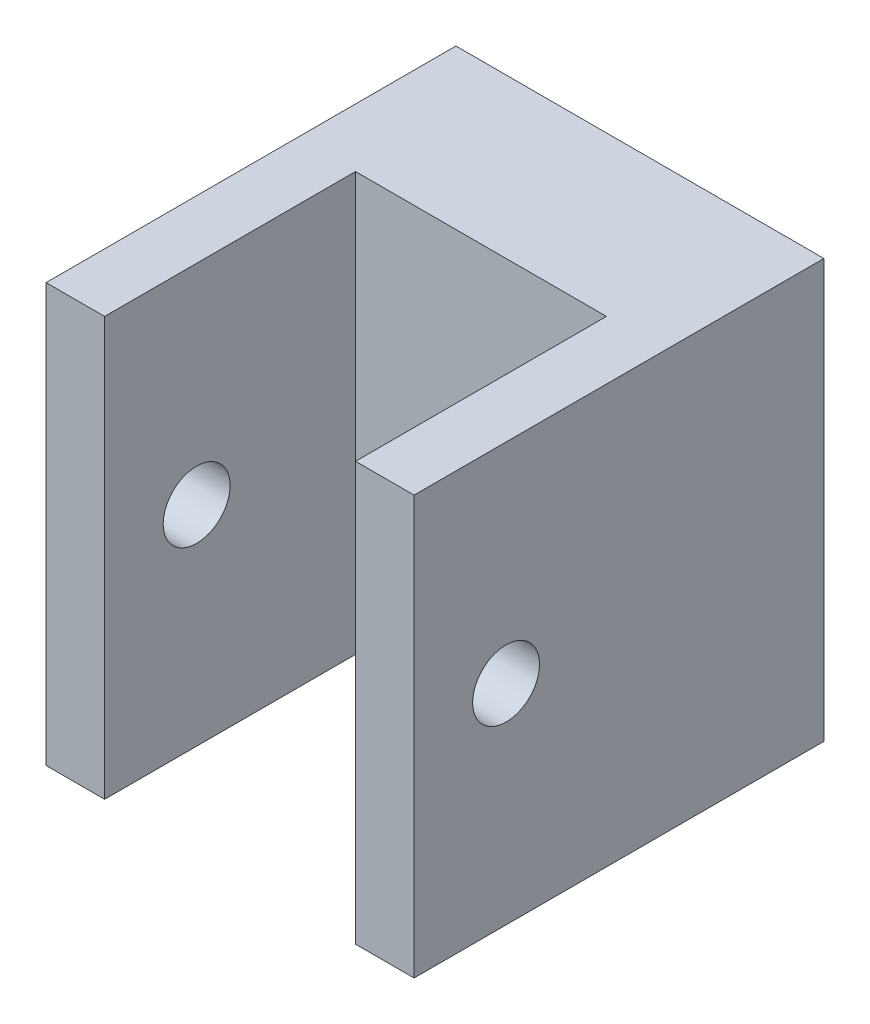
ISO-10303-21;
HEADER;
FILE_DESCRIPTION(('STEP AP214'),'2;1');
FILE_NAME('part.step','',(''),(''),'','','');
FILE_SCHEMA(('AUTOMOTIVE_DESIGN { 1 0 10303 214 1 1 1 1 }'));
ENDSEC;
DATA;
#1=APPLICATION_CONTEXT('core data for automotive mechanical design processes');
#2=APPLICATION_PROTOCOL_DEFINITION('international standard','automotive_design',2000,#1);
#3=PRODUCT_CONTEXT('',#1,'mechanical');
#4=PRODUCT('Part','Part','',(#3));
#5=PRODUCT_RELATED_PRODUCT_CATEGORY('part','',(#4));
#6=PRODUCT_DEFINITION_FORMATION('','',#4);
#7=PRODUCT_DEFINITION_CONTEXT('part definition',#1,'design');
#8=PRODUCT_DEFINITION('design','',#6,#7);
#9=PRODUCT_DEFINITION_SHAPE('','',#8);
#10=(LENGTH_UNIT() NAMED_UNIT(*) SI_UNIT(.MILLI.,.METRE.));
#11=(NAMED_UNIT(*) PLANE_ANGLE_UNIT() SI_UNIT($,.RADIAN.));
#12=(NAMED_UNIT(*) SI_UNIT($,.STERADIAN.) SOLID_ANGLE_UNIT());
#13=UNCERTAINTY_MEASURE_WITH_UNIT(LENGTH_MEASURE(1.E-05),#10,'distance_accuracy_value','');
#14=(GEOMETRIC_REPRESENTATION_CONTEXT(3) GLOBAL_UNCERTAINTY_ASSIGNED_CONTEXT((#13)) GLOBAL_UNIT_ASSIGNED_CONTEXT((#10,
#11,#12)) REPRESENTATION_CONTEXT('',''));
#15=CARTESIAN_POINT('',(0.,0.,0.));
#16=DIRECTION('',(0.,0.,1.));
#17=DIRECTION('',(1.,0.,0.));
#18=AXIS2_PLACEMENT_3D('',#15,#16,#17);
#19=CARTESIAN_POINT('',(0.,50.,-22.));
#20=DIRECTION('',(0.,0.,1.));
#21=DIRECTION('',(1.,0.,0.));
#22=AXIS2_PLACEMENT_3D('',#19,#20,#21);
#23=PLANE('',#22);
#24=DIRECTION('',(0.,1.,0.));
#25=VECTOR('',#24,1.);
#26=CARTESIAN_POINT('',(15.078186515748,0.,-22.));
#27=LINE('',#26,#25);
#28=CARTESIAN_POINT('',(15.078186515748,0.,-22.));
#29=VERTEX_POINT('',#28);
#30=CARTESIAN_POINT('',(15.078186515748,10.795,-22.));
#31=VERTEX_POINT('',#30);
#32=EDGE_CURVE('E256',#29,#31,#27,.T.);
#33=ORIENTED_EDGE('',*,*,#32,.F.);
#34=DIRECTION('',(-1.,0.,0.));
#35=VECTOR('',#34,1.);
#36=CARTESIAN_POINT('',(0.,0.,-22.));
#37=LINE('',#36,#35);
#38=CARTESIAN_POINT('',(5.07818651574803,0.,-22.));
#39=VERTEX_POINT('',#38);
#40=EDGE_CURVE('E160',#29,#39,#37,.T.);
#41=ORIENTED_EDGE('',*,*,#40,.T.);
#42=DIRECTION('',(0.,1.,0.));
#43=VECTOR('',#42,1.);
#44=CARTESIAN_POINT('',(5.07818651574803,0.,-22.));
#45=LINE('',#44,#43);
#46=CARTESIAN_POINT('',(5.07818651574803,10.795,-22.));
#47=VERTEX_POINT('',#46);
#48=EDGE_CURVE('E273',#39,#47,#45,.T.);
#49=ORIENTED_EDGE('',*,*,#48,.T.);
#50=CARTESIAN_POINT('',(10.078186515748,10.795,-22.));
#51=DIRECTION('',(0.,0.,-1.));
#52=DIRECTION('',(-1.,0.,0.));
#53=AXIS2_PLACEMENT_3D('',#50,#51,#52);
#54=CIRCLE('',#53,5.);
#55=EDGE_CURVE('E54',#47,#31,#54,.T.);
#56=ORIENTED_EDGE('',*,*,#55,.T.);
#57=EDGE_LOOP('',(#33,#41,#49,#56));
#58=FACE_BOUND('',#57,.T.);
#59=ADVANCED_FACE('F39',(#58),#23,.F.);
#60=CARTESIAN_POINT('',(-22.,50.,0.));
#61=DIRECTION('',(-1.,0.,0.));
#62=DIRECTION('',(0.,0.,1.));
#63=AXIS2_PLACEMENT_3D('',#60,#61,#62);
#64=PLANE('',#63);
#65=CARTESIAN_POINT('',(-22.,25.,4.));
#66=DIRECTION('',(-1.,0.,0.));
#67=DIRECTION('',(0.,0.,1.));
#68=AXIS2_PLACEMENT_3D('',#65,#66,#67);
#69=CIRCLE('',#68,4.);
#70=CARTESIAN_POINT('',(-22.,25.,8.));
#71=VERTEX_POINT('',#70);
#72=EDGE_CURVE('E343',#71,#71,#69,.T.);
#73=ORIENTED_EDGE('',*,*,#72,.F.);
#74=EDGE_LOOP('',(#73));
#75=FACE_BOUND('',#74,.T.);
#76=DIRECTION('',(0.,0.,-1.));
#77=VECTOR('',#76,1.);
#78=CARTESIAN_POINT('',(-22.,0.,0.));
#79=LINE('',#78,#77);
#80=CARTESIAN_POINT('',(-22.,0.,15.));
#81=VERTEX_POINT('',#80);
#82=CARTESIAN_POINT('',(-22.,0.,-34.));
#83=VERTEX_POINT('',#82);
#84=EDGE_CURVE('E138',#81,#83,#79,.T.);
#85=ORIENTED_EDGE('',*,*,#84,.F.);
#86=DIRECTION('',(0.,-1.,0.));
#87=VECTOR('',#86,1.);
#88=CARTESIAN_POINT('',(-22.,50.,15.));
#89=LINE('',#88,#87);
#90=CARTESIAN_POINT('',(-22.,50.,15.));
#91=VERTEX_POINT('',#90);
#92=EDGE_CURVE('E11',#91,#81,#89,.T.);
#93=ORIENTED_EDGE('',*,*,#92,.F.);
#94=DIRECTION('',(0.,0.,-1.));
#95=VECTOR('',#94,1.);
#96=CARTESIAN_POINT('',(-22.,50.,0.));
#97=LINE('',#96,#95);
#98=CARTESIAN_POINT('',(-22.,50.,-34.));
#99=VERTEX_POINT('',#98);
#100=EDGE_CURVE('E307',#91,#99,#97,.T.);
#101=ORIENTED_EDGE('',*,*,#100,.T.);
#102=DIRECTION('',(0.,1.,0.));
#103=VECTOR('',#102,1.);
#104=CARTESIAN_POINT('',(-22.,50.,-34.));
#105=LINE('',#104,#103);
#106=EDGE_CURVE('E192',#83,#99,#105,.T.);
#107=ORIENTED_EDGE('',*,*,#106,.F.);
#108=EDGE_LOOP('',(#85,#93,#101,#107));
#109=FACE_BOUND('',#108,.T.);
#110=ADVANCED_FACE('F41',(#75,#109),#64,.T.);
#111=CARTESIAN_POINT('',(0.,50.,15.));
#112=DIRECTION('',(0.,0.,1.));
#113=DIRECTION('',(1.,0.,0.));
#114=AXIS2_PLACEMENT_3D('',#111,#112,#113);
#115=PLANE('',#114);
#116=DIRECTION('',(-1.,0.,0.));
#117=VECTOR('',#116,1.);
#118=CARTESIAN_POINT('',(0.,0.,15.));
#119=LINE('',#118,#117);
#120=CARTESIAN_POINT('',(-15.,0.,15.));
#121=VERTEX_POINT('',#120);
#122=EDGE_CURVE('E141',#121,#81,#119,.T.);
#123=ORIENTED_EDGE('',*,*,#122,.F.);
#124=DIRECTION('',(0.,-1.,0.));
#125=VECTOR('',#124,1.);
#126=CARTESIAN_POINT('',(-15.,50.,15.));
#127=LINE('',#126,#125);
#128=CARTESIAN_POINT('',(-15.,50.,15.));
#129=VERTEX_POINT('',#128);
#130=EDGE_CURVE('E47',#129,#121,#127,.T.);
#131=ORIENTED_EDGE('',*,*,#130,.F.);
#132=DIRECTION('',(-1.,0.,0.));
#133=VECTOR('',#132,1.);
#134=CARTESIAN_POINT('',(0.,50.,15.));
#135=LINE('',#134,#133);
#136=EDGE_CURVE('E309',#129,#91,#135,.T.);
#137=ORIENTED_EDGE('',*,*,#136,.T.);
#138=ORIENTED_EDGE('',*,*,#92,.T.);
#139=EDGE_LOOP('',(#123,#131,#137,#138));
#140=FACE_BOUND('',#139,.T.);
#141=ADVANCED_FACE('F169',(#140),#115,.T.);
#142=CARTESIAN_POINT('',(-15.,50.,0.));
#143=DIRECTION('',(1.,0.,0.));
#144=DIRECTION('',(0.,0.,-1.));
#145=AXIS2_PLACEMENT_3D('',#142,#143,#144);
#146=PLANE('',#145);
#147=CARTESIAN_POINT('',(-15.,25.,4.));
#148=DIRECTION('',(1.,0.,0.));
#149=DIRECTION('',(0.,0.,-1.));
#150=AXIS2_PLACEMENT_3D('',#147,#148,#149);
#151=CIRCLE('',#150,4.);
#152=CARTESIAN_POINT('',(-15.,25.,0.));
#153=VERTEX_POINT('',#152);
#154=EDGE_CURVE('E203',#153,#153,#151,.T.);
#155=ORIENTED_EDGE('',*,*,#154,.F.);
#156=EDGE_LOOP('',(#155));
#157=FACE_BOUND('',#156,.T.);
#158=DIRECTION('',(0.,0.,1.));
#159=VECTOR('',#158,1.);
#160=CARTESIAN_POINT('',(-15.,0.,0.));
#161=LINE('',#160,#159);
#162=CARTESIAN_POINT('',(-15.,0.,-15.));
#163=VERTEX_POINT('',#162);
#164=EDGE_CURVE('E145',#163,#121,#161,.T.);
#165=ORIENTED_EDGE('',*,*,#164,.F.);
#166=DIRECTION('',(0.,-1.,0.));
#167=VECTOR('',#166,1.);
#168=CARTESIAN_POINT('',(-15.,50.,-15.));
#169=LINE('',#168,#167);
#170=CARTESIAN_POINT('',(-15.,50.,-15.));
#171=VERTEX_POINT('',#170);
#172=EDGE_CURVE('E127',#171,#163,#169,.T.);
#173=ORIENTED_EDGE('',*,*,#172,.F.);
#174=DIRECTION('',(0.,0.,1.));
#175=VECTOR('',#174,1.);
#176=CARTESIAN_POINT('',(-15.,50.,0.));
#177=LINE('',#176,#175);
#178=EDGE_CURVE('E116',#171,#129,#177,.T.);
#179=ORIENTED_EDGE('',*,*,#178,.T.);
#180=ORIENTED_EDGE('',*,*,#130,.T.);
#181=EDGE_LOOP('',(#165,#173,#179,#180));
#182=FACE_BOUND('',#181,.T.);
#183=ADVANCED_FACE('F166',(#157,#182),#146,.T.);
#184=CARTESIAN_POINT('',(0.,50.,-15.));
#185=DIRECTION('',(0.,0.,-1.));
#186=DIRECTION('',(-1.,0.,0.));
#187=AXIS2_PLACEMENT_3D('',#184,#185,#186);
#188=PLANE('',#187);
#189=DIRECTION('',(1.,0.,0.));
#190=VECTOR('',#189,1.);
#191=CARTESIAN_POINT('',(0.,0.,-15.));
#192=LINE('',#191,#190);
#193=CARTESIAN_POINT('',(15.,0.,-15.));
#194=VERTEX_POINT('',#193);
#195=EDGE_CURVE('E123',#163,#194,#192,.T.);
#196=ORIENTED_EDGE('',*,*,#195,.T.);
#197=DIRECTION('',(0.,-1.,0.));
#198=VECTOR('',#197,1.);
#199=CARTESIAN_POINT('',(15.,50.,-15.));
#200=LINE('',#199,#198);
#201=CARTESIAN_POINT('',(15.,50.,-15.));
#202=VERTEX_POINT('',#201);
#203=EDGE_CURVE('E120',#202,#194,#200,.T.);
#204=ORIENTED_EDGE('',*,*,#203,.F.);
#205=DIRECTION('',(1.,0.,0.));
#206=VECTOR('',#205,1.);
#207=CARTESIAN_POINT('',(0.,50.,-15.));
#208=LINE('',#207,#206);
#209=EDGE_CURVE('E108',#171,#202,#208,.T.);
#210=ORIENTED_EDGE('',*,*,#209,.F.);
#211=ORIENTED_EDGE('',*,*,#172,.T.);
#212=EDGE_LOOP('',(#196,#204,#210,#211));
#213=FACE_BOUND('',#212,.T.);
#214=ADVANCED_FACE('F121',(#213),#188,.F.);
#215=CARTESIAN_POINT('',(15.,50.,0.));
#216=DIRECTION('',(1.,0.,0.));
#217=DIRECTION('',(0.,0.,-1.));
#218=AXIS2_PLACEMENT_3D('',#215,#216,#217);
#219=PLANE('',#218);
#220=CARTESIAN_POINT('',(15.,25.,4.));
#221=DIRECTION('',(1.,0.,0.));
#222=DIRECTION('',(0.,0.,-1.));
#223=AXIS2_PLACEMENT_3D('',#220,#221,#222);
#224=CIRCLE('',#223,4.);
#225=CARTESIAN_POINT('',(15.,25.,0.));
#226=VERTEX_POINT('',#225);
#227=EDGE_CURVE('E339',#226,#226,#224,.T.);
#228=ORIENTED_EDGE('',*,*,#227,.T.);
#229=EDGE_LOOP('',(#228));
#230=FACE_BOUND('',#229,.T.);
#231=DIRECTION('',(0.,0.,1.));
#232=VECTOR('',#231,1.);
#233=CARTESIAN_POINT('',(15.,0.,0.));
#234=LINE('',#233,#232);
#235=CARTESIAN_POINT('',(15.,0.,15.));
#236=VERTEX_POINT('',#235);
#237=EDGE_CURVE('E149',#194,#236,#234,.T.);
#238=ORIENTED_EDGE('',*,*,#237,.T.);
#239=DIRECTION('',(0.,-1.,0.));
#240=VECTOR('',#239,1.);
#241=CARTESIAN_POINT('',(15.,50.,15.));
#242=LINE('',#241,#240);
#243=CARTESIAN_POINT('',(15.,50.,15.));
#244=VERTEX_POINT('',#243);
#245=EDGE_CURVE('E128',#244,#236,#242,.T.);
#246=ORIENTED_EDGE('',*,*,#245,.F.);
#247=DIRECTION('',(0.,0.,1.));
#248=VECTOR('',#247,1.);
#249=CARTESIAN_POINT('',(15.,50.,0.));
#250=LINE('',#249,#248);
#251=EDGE_CURVE('E112',#202,#244,#250,.T.);
#252=ORIENTED_EDGE('',*,*,#251,.F.);
#253=ORIENTED_EDGE('',*,*,#203,.T.);
#254=EDGE_LOOP('',(#238,#246,#252,#253));
#255=FACE_BOUND('',#254,.T.);
#256=ADVANCED_FACE('F130',(#230,#255),#219,.F.);
#257=CARTESIAN_POINT('',(0.,50.,15.));
#258=DIRECTION('',(0.,0.,1.));
#259=DIRECTION('',(1.,0.,0.));
#260=AXIS2_PLACEMENT_3D('',#257,#258,#259);
#261=PLANE('',#260);
#262=DIRECTION('',(-1.,0.,0.));
#263=VECTOR('',#262,1.);
#264=CARTESIAN_POINT('',(0.,0.,15.));
#265=LINE('',#264,#263);
#266=CARTESIAN_POINT('',(22.,0.,15.));
#267=VERTEX_POINT('',#266);
#268=EDGE_CURVE('E151',#267,#236,#265,.T.);
#269=ORIENTED_EDGE('',*,*,#268,.F.);
#270=DIRECTION('',(0.,-1.,0.));
#271=VECTOR('',#270,1.);
#272=CARTESIAN_POINT('',(22.,50.,15.));
#273=LINE('',#272,#271);
#274=CARTESIAN_POINT('',(22.,50.,15.));
#275=VERTEX_POINT('',#274);
#276=EDGE_CURVE('E63',#275,#267,#273,.T.);
#277=ORIENTED_EDGE('',*,*,#276,.F.);
#278=DIRECTION('',(-1.,0.,0.));
#279=VECTOR('',#278,1.);
#280=CARTESIAN_POINT('',(0.,50.,15.));
#281=LINE('',#280,#279);
#282=EDGE_CURVE('E131',#275,#244,#281,.T.);
#283=ORIENTED_EDGE('',*,*,#282,.T.);
#284=ORIENTED_EDGE('',*,*,#245,.T.);
#285=EDGE_LOOP('',(#269,#277,#283,#284));
#286=FACE_BOUND('',#285,.T.);
#287=ADVANCED_FACE('F173',(#286),#261,.T.);
#288=CARTESIAN_POINT('',(22.,50.,0.));
#289=DIRECTION('',(1.,0.,0.));
#290=DIRECTION('',(0.,0.,-1.));
#291=AXIS2_PLACEMENT_3D('',#288,#289,#290);
#292=PLANE('',#291);
#293=CARTESIAN_POINT('',(22.,25.,4.));
#294=DIRECTION('',(-1.,0.,0.));
#295=DIRECTION('',(0.,0.,1.));
#296=AXIS2_PLACEMENT_3D('',#293,#294,#295);
#297=CIRCLE('',#296,4.);
#298=CARTESIAN_POINT('',(22.,25.,8.));
#299=VERTEX_POINT('',#298);
#300=EDGE_CURVE('E342',#299,#299,#297,.T.);
#301=ORIENTED_EDGE('',*,*,#300,.T.);
#302=EDGE_LOOP('',(#301));
#303=FACE_BOUND('',#302,.T.);
#304=DIRECTION('',(0.,0.,1.));
#305=VECTOR('',#304,1.);
#306=CARTESIAN_POINT('',(22.,0.,0.));
#307=LINE('',#306,#305);
#308=CARTESIAN_POINT('',(22.,0.,-34.));
#309=VERTEX_POINT('',#308);
#310=EDGE_CURVE('E154',#309,#267,#307,.T.);
#311=ORIENTED_EDGE('',*,*,#310,.F.);
#312=DIRECTION('',(0.,-1.,0.));
#313=VECTOR('',#312,1.);
#314=CARTESIAN_POINT('',(22.,50.,-34.));
#315=LINE('',#314,#313);
#316=CARTESIAN_POINT('',(22.,50.,-34.));
#317=VERTEX_POINT('',#316);
#318=EDGE_CURVE('E181',#317,#309,#315,.T.);
#319=ORIENTED_EDGE('',*,*,#318,.F.);
#320=DIRECTION('',(0.,0.,1.));
#321=VECTOR('',#320,1.);
#322=CARTESIAN_POINT('',(22.,50.,0.));
#323=LINE('',#322,#321);
#324=EDGE_CURVE('E133',#317,#275,#323,.T.);
#325=ORIENTED_EDGE('',*,*,#324,.T.);
#326=ORIENTED_EDGE('',*,*,#276,.T.);
#327=EDGE_LOOP('',(#311,#319,#325,#326));
#328=FACE_BOUND('',#327,.T.);
#329=ADVANCED_FACE('F179',(#303,#328),#292,.T.);
#330=CARTESIAN_POINT('',(-2.22181348425198,0.,-22.));
#331=VERTEX_POINT('',#330);
#332=CARTESIAN_POINT('',(-12.221813484252,0.,-22.));
#333=VERTEX_POINT('',#332);
#334=EDGE_CURVE('E157',#331,#333,#37,.T.);
#335=ORIENTED_EDGE('',*,*,#334,.T.);
#336=DIRECTION('',(0.,1.,0.));
#337=VECTOR('',#336,1.);
#338=CARTESIAN_POINT('',(-12.221813484252,0.,-22.));
#339=LINE('',#338,#337);
#340=CARTESIAN_POINT('',(-12.221813484252,35.179,-22.));
#341=VERTEX_POINT('',#340);
#342=EDGE_CURVE('E282',#333,#341,#339,.T.);
#343=ORIENTED_EDGE('',*,*,#342,.T.);
#344=CARTESIAN_POINT('',(-7.22181348425197,35.179,-22.));
#345=DIRECTION('',(0.,0.,-1.));
#346=DIRECTION('',(-1.,0.,0.));
#347=AXIS2_PLACEMENT_3D('',#344,#345,#346);
#348=CIRCLE('',#347,5.);
#349=CARTESIAN_POINT('',(-2.22181348425198,35.179,-22.));
#350=VERTEX_POINT('',#349);
#351=EDGE_CURVE('E279',#341,#350,#348,.T.);
#352=ORIENTED_EDGE('',*,*,#351,.T.);
#353=DIRECTION('',(0.,1.,0.));
#354=VECTOR('',#353,1.);
#355=CARTESIAN_POINT('',(-2.22181348425198,0.,-22.));
#356=LINE('',#355,#354);
#357=EDGE_CURVE('E276',#331,#350,#356,.T.);
#358=ORIENTED_EDGE('',*,*,#357,.F.);
#359=EDGE_LOOP('',(#335,#343,#352,#358));
#360=FACE_BOUND('',#359,.T.);
#361=ADVANCED_FACE('F369',(#360),#23,.F.);
#362=CARTESIAN_POINT('',(0.,50.,0.));
#363=DIRECTION('',(0.,1.,0.));
#364=DIRECTION('',(0.,0.,1.));
#365=AXIS2_PLACEMENT_3D('',#362,#363,#364);
#366=PLANE('',#365);
#367=ORIENTED_EDGE('',*,*,#100,.F.);
#368=ORIENTED_EDGE('',*,*,#136,.F.);
#369=ORIENTED_EDGE('',*,*,#178,.F.);
#370=ORIENTED_EDGE('',*,*,#209,.T.);
#371=ORIENTED_EDGE('',*,*,#251,.T.);
#372=ORIENTED_EDGE('',*,*,#282,.F.);
#373=ORIENTED_EDGE('',*,*,#324,.F.);
#374=DIRECTION('',(1.,0.,0.));
#375=VECTOR('',#374,1.);
#376=CARTESIAN_POINT('',(22.,50.,-34.));
#377=LINE('',#376,#375);
#378=EDGE_CURVE('E188',#99,#317,#377,.T.);
#379=ORIENTED_EDGE('',*,*,#378,.F.);
#380=EDGE_LOOP('',(#367,#368,#369,#370,#371,#372,#373,#379));
#381=FACE_BOUND('',#380,.T.);
#382=ADVANCED_FACE('F110',(#381),#366,.T.);
#383=CARTESIAN_POINT('',(0.,0.,0.));
#384=DIRECTION('',(0.,1.,0.));
#385=DIRECTION('',(0.,0.,1.));
#386=AXIS2_PLACEMENT_3D('',#383,#384,#385);
#387=PLANE('',#386);
#388=ORIENTED_EDGE('',*,*,#84,.T.);
#389=DIRECTION('',(-1.,0.,0.));
#390=VECTOR('',#389,1.);
#391=CARTESIAN_POINT('',(-10.221813484252,0.,-34.));
#392=LINE('',#391,#390);
#393=CARTESIAN_POINT('',(-10.221813484252,0.,-34.));
#394=VERTEX_POINT('',#393);
#395=EDGE_CURVE('E319',#394,#83,#392,.T.);
#396=ORIENTED_EDGE('',*,*,#395,.F.);
#397=DIRECTION('',(0.,0.,1.));
#398=VECTOR('',#397,1.);
#399=CARTESIAN_POINT('',(-10.221813484252,0.,-34.));
#400=LINE('',#399,#398);
#401=CARTESIAN_POINT('',(-10.221813484252,0.,-28.));
#402=VERTEX_POINT('',#401);
#403=EDGE_CURVE('E234',#394,#402,#400,.T.);
#404=ORIENTED_EDGE('',*,*,#403,.T.);
#405=DIRECTION('',(-1.,0.,0.));
#406=VECTOR('',#405,1.);
#407=CARTESIAN_POINT('',(-10.221813484252,0.,-28.));
#408=LINE('',#407,#406);
#409=CARTESIAN_POINT('',(-12.221813484252,0.,-28.));
#410=VERTEX_POINT('',#409);
#411=EDGE_CURVE('E219',#402,#410,#408,.T.);
#412=ORIENTED_EDGE('',*,*,#411,.T.);
#413=DIRECTION('',(0.,0.,1.));
#414=VECTOR('',#413,1.);
#415=CARTESIAN_POINT('',(-12.221813484252,0.,-28.));
#416=LINE('',#415,#414);
#417=EDGE_CURVE('E291',#410,#333,#416,.T.);
#418=ORIENTED_EDGE('',*,*,#417,.T.);
#419=ORIENTED_EDGE('',*,*,#334,.F.);
#420=DIRECTION('',(0.,0.,1.));
#421=VECTOR('',#420,1.);
#422=CARTESIAN_POINT('',(-2.22181348425198,0.,-28.));
#423=LINE('',#422,#421);
#424=CARTESIAN_POINT('',(-2.22181348425198,0.,-28.));
#425=VERTEX_POINT('',#424);
#426=EDGE_CURVE('E300',#425,#331,#423,.T.);
#427=ORIENTED_EDGE('',*,*,#426,.F.);
#428=DIRECTION('',(-1.,0.,0.));
#429=VECTOR('',#428,1.);
#430=CARTESIAN_POINT('',(7.07818651574802,0.,-28.));
#431=LINE('',#430,#429);
#432=CARTESIAN_POINT('',(-4.22181348425198,0.,-28.));
#433=VERTEX_POINT('',#432);
#434=EDGE_CURVE('E206',#425,#433,#431,.T.);
#435=ORIENTED_EDGE('',*,*,#434,.T.);
#436=DIRECTION('',(0.,0.,1.));
#437=VECTOR('',#436,1.);
#438=CARTESIAN_POINT('',(-4.22181348425198,0.,-34.));
#439=LINE('',#438,#437);
#440=CARTESIAN_POINT('',(-4.22181348425198,0.,-34.));
#441=VERTEX_POINT('',#440);
#442=EDGE_CURVE('E243',#441,#433,#439,.T.);
#443=ORIENTED_EDGE('',*,*,#442,.F.);
#444=DIRECTION('',(-1.,0.,0.));
#445=VECTOR('',#444,1.);
#446=CARTESIAN_POINT('',(7.07818651574802,0.,-34.));
#447=LINE('',#446,#445);
#448=CARTESIAN_POINT('',(7.07818651574802,0.,-34.));
#449=VERTEX_POINT('',#448);
#450=EDGE_CURVE('E330',#449,#441,#447,.T.);
#451=ORIENTED_EDGE('',*,*,#450,.F.);
#452=DIRECTION('',(0.,0.,1.));
#453=VECTOR('',#452,1.);
#454=CARTESIAN_POINT('',(7.07818651574802,0.,-34.));
#455=LINE('',#454,#453);
#456=CARTESIAN_POINT('',(7.07818651574802,0.,-28.));
#457=VERTEX_POINT('',#456);
#458=EDGE_CURVE('E246',#449,#457,#455,.T.);
#459=ORIENTED_EDGE('',*,*,#458,.T.);
#460=CARTESIAN_POINT('',(5.07818651574803,0.,-28.));
#461=VERTEX_POINT('',#460);
#462=EDGE_CURVE('E207',#457,#461,#431,.T.);
#463=ORIENTED_EDGE('',*,*,#462,.T.);
#464=DIRECTION('',(0.,0.,1.));
#465=VECTOR('',#464,1.);
#466=CARTESIAN_POINT('',(5.07818651574803,0.,-28.));
#467=LINE('',#466,#465);
#468=EDGE_CURVE('E303',#461,#39,#467,.T.);
#469=ORIENTED_EDGE('',*,*,#468,.T.);
#470=ORIENTED_EDGE('',*,*,#40,.F.);
#471=DIRECTION('',(0.,0.,1.));
#472=VECTOR('',#471,1.);
#473=CARTESIAN_POINT('',(15.078186515748,0.,-28.));
#474=LINE('',#473,#472);
#475=CARTESIAN_POINT('',(15.078186515748,0.,-28.));
#476=VERTEX_POINT('',#475);
#477=EDGE_CURVE('E288',#476,#29,#474,.T.);
#478=ORIENTED_EDGE('',*,*,#477,.F.);
#479=DIRECTION('',(-1.,0.,0.));
#480=VECTOR('',#479,1.);
#481=CARTESIAN_POINT('',(22.,0.,-28.));
#482=LINE('',#481,#480);
#483=CARTESIAN_POINT('',(13.078186515748,0.,-28.));
#484=VERTEX_POINT('',#483);
#485=EDGE_CURVE('E222',#476,#484,#482,.T.);
#486=ORIENTED_EDGE('',*,*,#485,.T.);
#487=DIRECTION('',(0.,0.,1.));
#488=VECTOR('',#487,1.);
#489=CARTESIAN_POINT('',(13.078186515748,0.,-34.));
#490=LINE('',#489,#488);
#491=CARTESIAN_POINT('',(13.078186515748,0.,-34.));
#492=VERTEX_POINT('',#491);
#493=EDGE_CURVE('E231',#492,#484,#490,.T.);
#494=ORIENTED_EDGE('',*,*,#493,.F.);
#495=DIRECTION('',(-1.,0.,0.));
#496=VECTOR('',#495,1.);
#497=CARTESIAN_POINT('',(22.,0.,-34.));
#498=LINE('',#497,#496);
#499=EDGE_CURVE('E187',#309,#492,#498,.T.);
#500=ORIENTED_EDGE('',*,*,#499,.F.);
#501=ORIENTED_EDGE('',*,*,#310,.T.);
#502=ORIENTED_EDGE('',*,*,#268,.T.);
#503=ORIENTED_EDGE('',*,*,#237,.F.);
#504=ORIENTED_EDGE('',*,*,#195,.F.);
#505=ORIENTED_EDGE('',*,*,#164,.T.);
#506=ORIENTED_EDGE('',*,*,#122,.T.);
#507=EDGE_LOOP('',(#388,#396,#404,#412,#418,#419,#427,#435,#443,#451,#459,#463,#469,#470,#478,
#486,#494,#500,#501,#502,#503,#504,#505,#506));
#508=FACE_BOUND('',#507,.T.);
#509=ADVANCED_FACE('F171',(#508),#387,.F.);
#510=CARTESIAN_POINT('',(10.078186515748,10.795,-28.));
#511=DIRECTION('',(0.,0.,1.));
#512=DIRECTION('',(1.,0.,0.));
#513=AXIS2_PLACEMENT_3D('',#510,#511,#512);
#514=CYLINDRICAL_SURFACE('',#513,5.);
#515=ORIENTED_EDGE('',*,*,#55,.F.);
#516=DIRECTION('',(0.,0.,1.));
#517=VECTOR('',#516,1.);
#518=CARTESIAN_POINT('',(5.07818651574803,10.795,-28.));
#519=LINE('',#518,#517);
#520=CARTESIAN_POINT('',(5.07818651574803,10.795,-28.));
#521=VERTEX_POINT('',#520);
#522=EDGE_CURVE('E142',#521,#47,#519,.T.);
#523=ORIENTED_EDGE('',*,*,#522,.F.);
#524=CARTESIAN_POINT('',(10.078186515748,10.795,-28.));
#525=DIRECTION('',(0.,0.,-1.));
#526=DIRECTION('',(-1.,0.,0.));
#527=AXIS2_PLACEMENT_3D('',#524,#525,#526);
#528=CIRCLE('',#527,5.);
#529=CARTESIAN_POINT('',(15.078186515748,10.795,-28.));
#530=VERTEX_POINT('',#529);
#531=EDGE_CURVE('E252',#521,#530,#528,.T.);
#532=ORIENTED_EDGE('',*,*,#531,.T.);
#533=DIRECTION('',(0.,0.,1.));
#534=VECTOR('',#533,1.);
#535=CARTESIAN_POINT('',(15.078186515748,10.795,-28.));
#536=LINE('',#535,#534);
#537=EDGE_CURVE('E271',#530,#31,#536,.T.);
#538=ORIENTED_EDGE('',*,*,#537,.T.);
#539=EDGE_LOOP('',(#515,#523,#532,#538));
#540=FACE_BOUND('',#539,.T.);
#541=ADVANCED_FACE('F508',(#540),#514,.F.);
#542=CARTESIAN_POINT('',(5.07818651574803,0.,-28.));
#543=DIRECTION('',(1.,0.,0.));
#544=DIRECTION('',(0.,0.,-1.));
#545=AXIS2_PLACEMENT_3D('',#542,#543,#544);
#546=PLANE('',#545);
#547=ORIENTED_EDGE('',*,*,#48,.F.);
#548=ORIENTED_EDGE('',*,*,#468,.F.);
#549=DIRECTION('',(0.,1.,0.));
#550=VECTOR('',#549,1.);
#551=CARTESIAN_POINT('',(5.07818651574803,0.,-28.));
#552=LINE('',#551,#550);
#553=EDGE_CURVE('E255',#461,#521,#552,.T.);
#554=ORIENTED_EDGE('',*,*,#553,.T.);
#555=ORIENTED_EDGE('',*,*,#522,.T.);
#556=EDGE_LOOP('',(#547,#548,#554,#555));
#557=FACE_BOUND('',#556,.T.);
#558=ADVANCED_FACE('F501',(#557),#546,.T.);
#559=CARTESIAN_POINT('',(-2.22181348425198,0.,-28.));
#560=DIRECTION('',(1.,0.,0.));
#561=DIRECTION('',(0.,1.,0.));
#562=AXIS2_PLACEMENT_3D('',#559,#560,#561);
#563=PLANE('',#562);
#564=ORIENTED_EDGE('',*,*,#357,.T.);
#565=DIRECTION('',(0.,0.,1.));
#566=VECTOR('',#565,1.);
#567=CARTESIAN_POINT('',(-2.22181348425198,35.179,-28.));
#568=LINE('',#567,#566);
#569=CARTESIAN_POINT('',(-2.22181348425198,35.179,-28.));
#570=VERTEX_POINT('',#569);
#571=EDGE_CURVE('E297',#570,#350,#568,.T.);
#572=ORIENTED_EDGE('',*,*,#571,.F.);
#573=DIRECTION('',(0.,1.,0.));
#574=VECTOR('',#573,1.);
#575=CARTESIAN_POINT('',(-2.22181348425198,0.,-28.));
#576=LINE('',#575,#574);
#577=EDGE_CURVE('E259',#425,#570,#576,.T.);
#578=ORIENTED_EDGE('',*,*,#577,.F.);
#579=ORIENTED_EDGE('',*,*,#426,.T.);
#580=EDGE_LOOP('',(#564,#572,#578,#579));
#581=FACE_BOUND('',#580,.T.);
#582=ADVANCED_FACE('F499',(#581),#563,.F.);
#583=CARTESIAN_POINT('',(-7.22181348425197,35.179,-28.));
#584=DIRECTION('',(0.,0.,1.));
#585=DIRECTION('',(1.,0.,0.));
#586=AXIS2_PLACEMENT_3D('',#583,#584,#585);
#587=CYLINDRICAL_SURFACE('',#586,5.);
#588=ORIENTED_EDGE('',*,*,#351,.F.);
#589=DIRECTION('',(0.,0.,1.));
#590=VECTOR('',#589,1.);
#591=CARTESIAN_POINT('',(-12.221813484252,35.179,-28.));
#592=LINE('',#591,#590);
#593=CARTESIAN_POINT('',(-12.221813484252,35.179,-28.));
#594=VERTEX_POINT('',#593);
#595=EDGE_CURVE('E294',#594,#341,#592,.T.);
#596=ORIENTED_EDGE('',*,*,#595,.F.);
#597=CARTESIAN_POINT('',(-7.22181348425197,35.179,-28.));
#598=DIRECTION('',(0.,0.,-1.));
#599=DIRECTION('',(-1.,0.,0.));
#600=AXIS2_PLACEMENT_3D('',#597,#598,#599);
#601=CIRCLE('',#600,5.);
#602=EDGE_CURVE('E262',#594,#570,#601,.T.);
#603=ORIENTED_EDGE('',*,*,#602,.T.);
#604=ORIENTED_EDGE('',*,*,#571,.T.);
#605=EDGE_LOOP('',(#588,#596,#603,#604));
#606=FACE_BOUND('',#605,.T.);
#607=ADVANCED_FACE('F498',(#606),#587,.F.);
#608=CARTESIAN_POINT('',(-12.221813484252,0.,-28.));
#609=DIRECTION('',(1.,0.,0.));
#610=DIRECTION('',(0.,0.,-1.));
#611=AXIS2_PLACEMENT_3D('',#608,#609,#610);
#612=PLANE('',#611);
#613=ORIENTED_EDGE('',*,*,#342,.F.);
#614=ORIENTED_EDGE('',*,*,#417,.F.);
#615=DIRECTION('',(0.,1.,0.));
#616=VECTOR('',#615,1.);
#617=CARTESIAN_POINT('',(-12.221813484252,0.,-28.));
#618=LINE('',#617,#616);
#619=EDGE_CURVE('E265',#410,#594,#618,.T.);
#620=ORIENTED_EDGE('',*,*,#619,.T.);
#621=ORIENTED_EDGE('',*,*,#595,.T.);
#622=EDGE_LOOP('',(#613,#614,#620,#621));
#623=FACE_BOUND('',#622,.T.);
#624=ADVANCED_FACE('F495',(#623),#612,.T.);
#625=CARTESIAN_POINT('',(15.078186515748,0.,-28.));
#626=DIRECTION('',(1.,0.,0.));
#627=DIRECTION('',(0.,0.,-1.));
#628=AXIS2_PLACEMENT_3D('',#625,#626,#627);
#629=PLANE('',#628);
#630=ORIENTED_EDGE('',*,*,#32,.T.);
#631=ORIENTED_EDGE('',*,*,#537,.F.);
#632=DIRECTION('',(0.,1.,0.));
#633=VECTOR('',#632,1.);
#634=CARTESIAN_POINT('',(15.078186515748,0.,-28.));
#635=LINE('',#634,#633);
#636=EDGE_CURVE('E268',#476,#530,#635,.T.);
#637=ORIENTED_EDGE('',*,*,#636,.F.);
#638=ORIENTED_EDGE('',*,*,#477,.T.);
#639=EDGE_LOOP('',(#630,#631,#637,#638));
#640=FACE_BOUND('',#639,.T.);
#641=ADVANCED_FACE('F431',(#640),#629,.F.);
#642=CARTESIAN_POINT('',(10.078186515748,10.795,-28.));
#643=DIRECTION('',(0.,0.,-1.));
#644=DIRECTION('',(-1.,0.,0.));
#645=AXIS2_PLACEMENT_3D('',#642,#643,#644);
#646=PLANE('',#645);
#647=ORIENTED_EDGE('',*,*,#434,.F.);
#648=ORIENTED_EDGE('',*,*,#577,.T.);
#649=ORIENTED_EDGE('',*,*,#602,.F.);
#650=ORIENTED_EDGE('',*,*,#619,.F.);
#651=ORIENTED_EDGE('',*,*,#411,.F.);
#652=DIRECTION('',(0.,-1.,0.));
#653=VECTOR('',#652,1.);
#654=CARTESIAN_POINT('',(-10.221813484252,35.179,-28.));
#655=LINE('',#654,#653);
#656=CARTESIAN_POINT('',(-10.221813484252,35.179,-28.));
#657=VERTEX_POINT('',#656);
#658=EDGE_CURVE('E216',#657,#402,#655,.T.);
#659=ORIENTED_EDGE('',*,*,#658,.F.);
#660=CARTESIAN_POINT('',(-7.22181348425197,35.179,-28.));
#661=DIRECTION('',(0.,0.,1.));
#662=DIRECTION('',(-1.,0.,0.));
#663=AXIS2_PLACEMENT_3D('',#660,#661,#662);
#664=CIRCLE('',#663,3.);
#665=CARTESIAN_POINT('',(-4.22181348425197,35.179,-28.));
#666=VERTEX_POINT('',#665);
#667=EDGE_CURVE('E213',#666,#657,#664,.T.);
#668=ORIENTED_EDGE('',*,*,#667,.F.);
#669=DIRECTION('',(0.,1.,0.));
#670=VECTOR('',#669,1.);
#671=CARTESIAN_POINT('',(-4.22181348425197,35.179,-28.));
#672=LINE('',#671,#670);
#673=EDGE_CURVE('E210',#433,#666,#672,.T.);
#674=ORIENTED_EDGE('',*,*,#673,.F.);
#675=EDGE_LOOP('',(#647,#648,#649,#650,#651,#659,#668,#674));
#676=FACE_BOUND('',#675,.T.);
#677=ADVANCED_FACE('F492',(#676),#646,.F.);
#678=CARTESIAN_POINT('',(10.078186515748,10.795,-34.));
#679=DIRECTION('',(0.,0.,1.));
#680=DIRECTION('',(1.,0.,0.));
#681=AXIS2_PLACEMENT_3D('',#678,#679,#680);
#682=CYLINDRICAL_SURFACE('',#681,3.);
#683=CARTESIAN_POINT('',(10.078186515748,10.795,-28.));
#684=DIRECTION('',(0.,0.,1.));
#685=DIRECTION('',(-1.,0.,0.));
#686=AXIS2_PLACEMENT_3D('',#683,#684,#685);
#687=CIRCLE('',#686,3.);
#688=CARTESIAN_POINT('',(13.078186515748,10.795,-28.));
#689=VERTEX_POINT('',#688);
#690=CARTESIAN_POINT('',(7.07818651574803,10.795,-28.));
#691=VERTEX_POINT('',#690);
#692=EDGE_CURVE('E199',#689,#691,#687,.T.);
#693=ORIENTED_EDGE('',*,*,#692,.T.);
#694=DIRECTION('',(0.,0.,1.));
#695=VECTOR('',#694,1.);
#696=CARTESIAN_POINT('',(7.07818651574803,10.795,-34.));
#697=LINE('',#696,#695);
#698=CARTESIAN_POINT('',(7.07818651574803,10.795,-34.));
#699=VERTEX_POINT('',#698);
#700=EDGE_CURVE('E249',#699,#691,#697,.T.);
#701=ORIENTED_EDGE('',*,*,#700,.F.);
#702=CARTESIAN_POINT('',(10.078186515748,10.795,-34.));
#703=DIRECTION('',(0.,0.,1.));
#704=DIRECTION('',(-1.,0.,0.));
#705=AXIS2_PLACEMENT_3D('',#702,#703,#704);
#706=CIRCLE('',#705,3.);
#707=CARTESIAN_POINT('',(13.078186515748,10.795,-34.));
#708=VERTEX_POINT('',#707);
#709=EDGE_CURVE('E228',#708,#699,#706,.T.);
#710=ORIENTED_EDGE('',*,*,#709,.F.);
#711=DIRECTION('',(0.,0.,1.));
#712=VECTOR('',#711,1.);
#713=CARTESIAN_POINT('',(13.078186515748,10.795,-34.));
#714=LINE('',#713,#712);
#715=EDGE_CURVE('E198',#708,#689,#714,.T.);
#716=ORIENTED_EDGE('',*,*,#715,.T.);
#717=EDGE_LOOP('',(#693,#701,#710,#716));
#718=FACE_BOUND('',#717,.T.);
#719=ADVANCED_FACE('F449',(#718),#682,.F.);
#720=CARTESIAN_POINT('',(7.07818651574803,10.795,-34.));
#721=DIRECTION('',(-1.,0.,0.));
#722=DIRECTION('',(0.,-1.,0.));
#723=AXIS2_PLACEMENT_3D('',#720,#721,#722);
#724=PLANE('',#723);
#725=DIRECTION('',(0.,-1.,0.));
#726=VECTOR('',#725,1.);
#727=CARTESIAN_POINT('',(7.07818651574803,10.795,-28.));
#728=LINE('',#727,#726);
#729=EDGE_CURVE('E202',#691,#457,#728,.T.);
#730=ORIENTED_EDGE('',*,*,#729,.T.);
#731=ORIENTED_EDGE('',*,*,#458,.F.);
#732=DIRECTION('',(0.,-1.,0.));
#733=VECTOR('',#732,1.);
#734=CARTESIAN_POINT('',(7.07818651574803,10.795,-34.));
#735=LINE('',#734,#733);
#736=EDGE_CURVE('E333',#699,#449,#735,.T.);
#737=ORIENTED_EDGE('',*,*,#736,.F.);
#738=ORIENTED_EDGE('',*,*,#700,.T.);
#739=EDGE_LOOP('',(#730,#731,#737,#738));
#740=FACE_BOUND('',#739,.T.);
#741=ADVANCED_FACE('F570',(#740),#724,.F.);
#742=CARTESIAN_POINT('',(-4.22181348425197,35.179,-34.));
#743=DIRECTION('',(1.,0.,0.));
#744=DIRECTION('',(0.,1.,0.));
#745=AXIS2_PLACEMENT_3D('',#742,#743,#744);
#746=PLANE('',#745);
#747=ORIENTED_EDGE('',*,*,#673,.T.);
#748=DIRECTION('',(0.,0.,1.));
#749=VECTOR('',#748,1.);
#750=CARTESIAN_POINT('',(-4.22181348425197,35.179,-34.));
#751=LINE('',#750,#749);
#752=CARTESIAN_POINT('',(-4.22181348425197,35.179,-34.));
#753=VERTEX_POINT('',#752);
#754=EDGE_CURVE('E240',#753,#666,#751,.T.);
#755=ORIENTED_EDGE('',*,*,#754,.F.);
#756=DIRECTION('',(0.,1.,0.));
#757=VECTOR('',#756,1.);
#758=CARTESIAN_POINT('',(-4.22181348425197,35.179,-34.));
#759=LINE('',#758,#757);
#760=EDGE_CURVE('E327',#441,#753,#759,.T.);
#761=ORIENTED_EDGE('',*,*,#760,.F.);
#762=ORIENTED_EDGE('',*,*,#442,.T.);
#763=EDGE_LOOP('',(#747,#755,#761,#762));
#764=FACE_BOUND('',#763,.T.);
#765=ADVANCED_FACE('F579',(#764),#746,.F.);
#766=CARTESIAN_POINT('',(-7.22181348425197,35.179,-34.));
#767=DIRECTION('',(0.,0.,1.));
#768=DIRECTION('',(1.,0.,0.));
#769=AXIS2_PLACEMENT_3D('',#766,#767,#768);
#770=CYLINDRICAL_SURFACE('',#769,3.);
#771=ORIENTED_EDGE('',*,*,#667,.T.);
#772=DIRECTION('',(0.,0.,1.));
#773=VECTOR('',#772,1.);
#774=CARTESIAN_POINT('',(-10.221813484252,35.179,-34.));
#775=LINE('',#774,#773);
#776=CARTESIAN_POINT('',(-10.221813484252,35.179,-34.));
#777=VERTEX_POINT('',#776);
#778=EDGE_CURVE('E237',#777,#657,#775,.T.);
#779=ORIENTED_EDGE('',*,*,#778,.F.);
#780=CARTESIAN_POINT('',(-7.22181348425197,35.179,-34.));
#781=DIRECTION('',(0.,0.,1.));
#782=DIRECTION('',(-1.,0.,0.));
#783=AXIS2_PLACEMENT_3D('',#780,#781,#782);
#784=CIRCLE('',#783,3.);
#785=EDGE_CURVE('E324',#753,#777,#784,.T.);
#786=ORIENTED_EDGE('',*,*,#785,.F.);
#787=ORIENTED_EDGE('',*,*,#754,.T.);
#788=EDGE_LOOP('',(#771,#779,#786,#787));
#789=FACE_BOUND('',#788,.T.);
#790=ADVANCED_FACE('F588',(#789),#770,.F.);
#791=CARTESIAN_POINT('',(-10.221813484252,35.179,-34.));
#792=DIRECTION('',(-1.,0.,0.));
#793=DIRECTION('',(0.,-1.,0.));
#794=AXIS2_PLACEMENT_3D('',#791,#792,#793);
#795=PLANE('',#794);
#796=ORIENTED_EDGE('',*,*,#658,.T.);
#797=ORIENTED_EDGE('',*,*,#403,.F.);
#798=DIRECTION('',(0.,-1.,0.));
#799=VECTOR('',#798,1.);
#800=CARTESIAN_POINT('',(-10.221813484252,35.179,-34.));
#801=LINE('',#800,#799);
#802=EDGE_CURVE('E320',#777,#394,#801,.T.);
#803=ORIENTED_EDGE('',*,*,#802,.F.);
#804=ORIENTED_EDGE('',*,*,#778,.T.);
#805=EDGE_LOOP('',(#796,#797,#803,#804));
#806=FACE_BOUND('',#805,.T.);
#807=ADVANCED_FACE('F484',(#806),#795,.F.);
#808=CARTESIAN_POINT('',(13.078186515748,10.795,-34.));
#809=DIRECTION('',(1.,0.,0.));
#810=DIRECTION('',(0.,1.,0.));
#811=AXIS2_PLACEMENT_3D('',#808,#809,#810);
#812=PLANE('',#811);
#813=DIRECTION('',(0.,1.,0.));
#814=VECTOR('',#813,1.);
#815=CARTESIAN_POINT('',(13.078186515748,10.795,-28.));
#816=LINE('',#815,#814);
#817=EDGE_CURVE('E225',#484,#689,#816,.T.);
#818=ORIENTED_EDGE('',*,*,#817,.T.);
#819=ORIENTED_EDGE('',*,*,#715,.F.);
#820=DIRECTION('',(0.,1.,0.));
#821=VECTOR('',#820,1.);
#822=CARTESIAN_POINT('',(13.078186515748,10.795,-34.));
#823=LINE('',#822,#821);
#824=EDGE_CURVE('E190',#492,#708,#823,.T.);
#825=ORIENTED_EDGE('',*,*,#824,.F.);
#826=ORIENTED_EDGE('',*,*,#493,.T.);
#827=EDGE_LOOP('',(#818,#819,#825,#826));
#828=FACE_BOUND('',#827,.T.);
#829=ADVANCED_FACE('F443',(#828),#812,.F.);
#830=CARTESIAN_POINT('',(10.078186515748,10.795,-34.));
#831=DIRECTION('',(0.,0.,-1.));
#832=DIRECTION('',(-1.,0.,0.));
#833=AXIS2_PLACEMENT_3D('',#830,#831,#832);
#834=PLANE('',#833);
#835=ORIENTED_EDGE('',*,*,#709,.T.);
#836=ORIENTED_EDGE('',*,*,#736,.T.);
#837=ORIENTED_EDGE('',*,*,#450,.T.);
#838=ORIENTED_EDGE('',*,*,#760,.T.);
#839=ORIENTED_EDGE('',*,*,#785,.T.);
#840=ORIENTED_EDGE('',*,*,#802,.T.);
#841=ORIENTED_EDGE('',*,*,#395,.T.);
#842=ORIENTED_EDGE('',*,*,#106,.T.);
#843=ORIENTED_EDGE('',*,*,#378,.T.);
#844=ORIENTED_EDGE('',*,*,#318,.T.);
#845=ORIENTED_EDGE('',*,*,#499,.T.);
#846=ORIENTED_EDGE('',*,*,#824,.T.);
#847=EDGE_LOOP('',(#835,#836,#837,#838,#839,#840,#841,#842,#843,#844,#845,#846));
#848=FACE_BOUND('',#847,.T.);
#849=ADVANCED_FACE('F316',(#848),#834,.T.);
#850=ORIENTED_EDGE('',*,*,#553,.F.);
#851=ORIENTED_EDGE('',*,*,#462,.F.);
#852=ORIENTED_EDGE('',*,*,#729,.F.);
#853=ORIENTED_EDGE('',*,*,#692,.F.);
#854=ORIENTED_EDGE('',*,*,#817,.F.);
#855=ORIENTED_EDGE('',*,*,#485,.F.);
#856=ORIENTED_EDGE('',*,*,#636,.T.);
#857=ORIENTED_EDGE('',*,*,#531,.F.);
#858=EDGE_LOOP('',(#850,#851,#852,#853,#854,#855,#856,#857));
#859=FACE_BOUND('',#858,.T.);
#860=ADVANCED_FACE('F354',(#859),#646,.F.);
#861=CARTESIAN_POINT('',(22.,25.,4.));
#862=DIRECTION('',(-1.,0.,0.));
#863=DIRECTION('',(0.,0.,1.));
#864=AXIS2_PLACEMENT_3D('',#861,#862,#863);
#865=CYLINDRICAL_SURFACE('',#864,4.);
#866=ORIENTED_EDGE('',*,*,#300,.F.);
#867=EDGE_LOOP('',(#866));
#868=FACE_BOUND('',#867,.T.);
#869=ORIENTED_EDGE('',*,*,#227,.F.);
#870=EDGE_LOOP('',(#869));
#871=FACE_BOUND('',#870,.T.);
#872=ADVANCED_FACE('F350',(#868,#871),#865,.F.);
#873=ORIENTED_EDGE('',*,*,#154,.T.);
#874=EDGE_LOOP('',(#873));
#875=FACE_BOUND('',#874,.T.);
#876=ORIENTED_EDGE('',*,*,#72,.T.);
#877=EDGE_LOOP('',(#876));
#878=FACE_BOUND('',#877,.T.);
#879=ADVANCED_FACE('F353',(#875,#878),#865,.F.);
#880=CLOSED_SHELL('',(#59,#110,#141,#183,#214,#256,#287,#329,#361,#382,#509,#541,#558,#582,#607,
#624,#641,#677,#719,#741,#765,#790,#807,#829,#849,#860,#872,#879));
#881=MANIFOLD_SOLID_BREP('B2',#880);
#882=ADVANCED_BREP_SHAPE_REPRESENTATION('',(#18,#881),#14);
#883=SHAPE_DEFINITION_REPRESENTATION(#9,#882);
ENDSEC;
END-ISO-10303-21;
